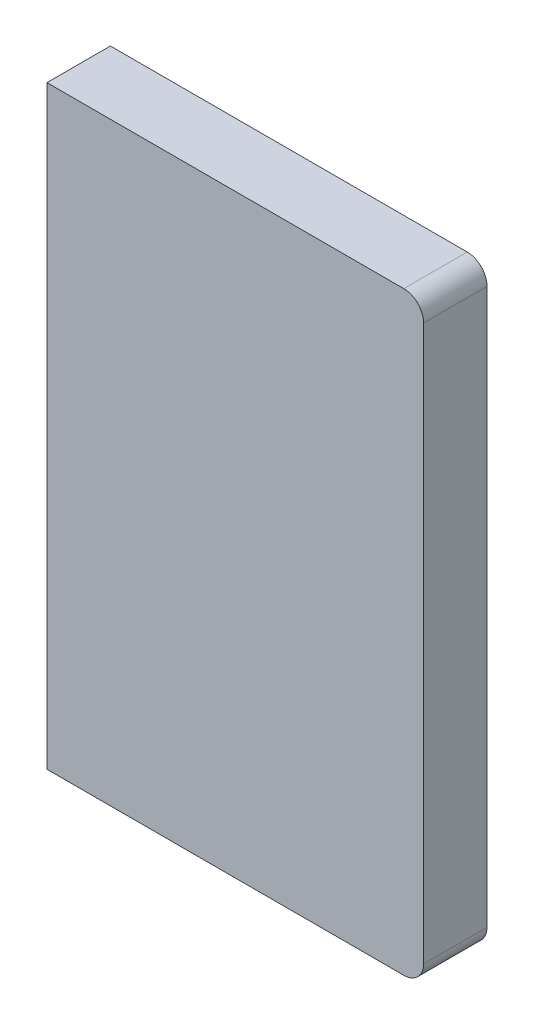
ISO-10303-21;
HEADER;
FILE_DESCRIPTION(('STEP AP214'),'2;1');
FILE_NAME('part.step','',(''),(''),'','','');
FILE_SCHEMA(('AUTOMOTIVE_DESIGN { 1 0 10303 214 1 1 1 1 }'));
ENDSEC;
DATA;
#1=APPLICATION_CONTEXT('core data for automotive mechanical design processes');
#2=APPLICATION_PROTOCOL_DEFINITION('international standard','automotive_design',2000,#1);
#3=PRODUCT_CONTEXT('',#1,'mechanical');
#4=PRODUCT('Part','Part','',(#3));
#5=PRODUCT_RELATED_PRODUCT_CATEGORY('part','',(#4));
#6=PRODUCT_DEFINITION_FORMATION('','',#4);
#7=PRODUCT_DEFINITION_CONTEXT('part definition',#1,'design');
#8=PRODUCT_DEFINITION('design','',#6,#7);
#9=PRODUCT_DEFINITION_SHAPE('','',#8);
#10=(LENGTH_UNIT() NAMED_UNIT(*) SI_UNIT(.MILLI.,.METRE.));
#11=(NAMED_UNIT(*) PLANE_ANGLE_UNIT() SI_UNIT($,.RADIAN.));
#12=(NAMED_UNIT(*) SI_UNIT($,.STERADIAN.) SOLID_ANGLE_UNIT());
#13=UNCERTAINTY_MEASURE_WITH_UNIT(LENGTH_MEASURE(1.E-05),#10,'distance_accuracy_value','');
#14=(GEOMETRIC_REPRESENTATION_CONTEXT(3) GLOBAL_UNCERTAINTY_ASSIGNED_CONTEXT((#13)) GLOBAL_UNIT_ASSIGNED_CONTEXT((#10,
#11,#12)) REPRESENTATION_CONTEXT('',''));
#15=CARTESIAN_POINT('',(0.,0.,0.));
#16=DIRECTION('',(0.,0.,1.));
#17=DIRECTION('',(1.,0.,0.));
#18=AXIS2_PLACEMENT_3D('',#15,#16,#17);
#19=CARTESIAN_POINT('',(-24.023067729949,103.735795388203,16.));
#20=DIRECTION('',(1.,0.,0.));
#21=DIRECTION('',(0.,1.,0.));
#22=AXIS2_PLACEMENT_3D('',#19,#20,#21);
#23=PLANE('',#22);
#24=DIRECTION('',(0.,-1.,0.));
#25=VECTOR('',#24,1.);
#26=CARTESIAN_POINT('',(-24.023067729949,103.735795388203,0.));
#27=LINE('',#26,#25);
#28=CARTESIAN_POINT('',(-24.023067729949,103.735795388203,0.));
#29=VERTEX_POINT('',#28);
#30=CARTESIAN_POINT('',(-24.023067729949,-46.2642046117975,0.));
#31=VERTEX_POINT('',#30);
#32=EDGE_CURVE('E105',#29,#31,#27,.T.);
#33=ORIENTED_EDGE('',*,*,#32,.T.);
#34=DIRECTION('',(0.,0.,-1.));
#35=VECTOR('',#34,1.);
#36=CARTESIAN_POINT('',(-24.023067729949,-46.2642046117975,16.));
#37=LINE('',#36,#35);
#38=CARTESIAN_POINT('',(-24.023067729949,-46.2642046117975,16.));
#39=VERTEX_POINT('',#38);
#40=EDGE_CURVE('E90',#39,#31,#37,.T.);
#41=ORIENTED_EDGE('',*,*,#40,.F.);
#42=DIRECTION('',(0.,-1.,0.));
#43=VECTOR('',#42,1.);
#44=CARTESIAN_POINT('',(-24.023067729949,103.735795388203,16.));
#45=LINE('',#44,#43);
#46=CARTESIAN_POINT('',(-24.023067729949,103.735795388203,16.));
#47=VERTEX_POINT('',#46);
#48=EDGE_CURVE('E94',#47,#39,#45,.T.);
#49=ORIENTED_EDGE('',*,*,#48,.F.);
#50=DIRECTION('',(0.,0.,-1.));
#51=VECTOR('',#50,1.);
#52=CARTESIAN_POINT('',(-24.023067729949,103.735795388203,16.));
#53=LINE('',#52,#51);
#54=EDGE_CURVE('E107',#47,#29,#53,.T.);
#55=ORIENTED_EDGE('',*,*,#54,.T.);
#56=EDGE_LOOP('',(#33,#41,#49,#55));
#57=FACE_BOUND('',#56,.T.);
#58=ADVANCED_FACE('F33',(#57),#23,.F.);
#59=CARTESIAN_POINT('',(-24.023067729949,-46.2642046117975,16.));
#60=DIRECTION('',(0.,1.,0.));
#61=DIRECTION('',(0.,0.,1.));
#62=AXIS2_PLACEMENT_3D('',#59,#60,#61);
#63=PLANE('',#62);
#64=DIRECTION('',(1.,0.,0.));
#65=VECTOR('',#64,1.);
#66=CARTESIAN_POINT('',(-24.023067729949,-46.2642046117975,0.));
#67=LINE('',#66,#65);
#68=CARTESIAN_POINT('',(65.976932270051,-46.2642046117975,0.));
#69=VERTEX_POINT('',#68);
#70=EDGE_CURVE('E133',#31,#69,#67,.T.);
#71=ORIENTED_EDGE('',*,*,#70,.T.);
#72=DIRECTION('',(0.,0.,-1.));
#73=VECTOR('',#72,1.);
#74=CARTESIAN_POINT('',(65.976932270051,-46.2642046117975,16.));
#75=LINE('',#74,#73);
#76=CARTESIAN_POINT('',(65.976932270051,-46.2642046117975,16.));
#77=VERTEX_POINT('',#76);
#78=EDGE_CURVE('E56',#69,#77,#75,.F.);
#79=ORIENTED_EDGE('',*,*,#78,.T.);
#80=DIRECTION('',(1.,0.,0.));
#81=VECTOR('',#80,1.);
#82=CARTESIAN_POINT('',(-24.023067729949,-46.2642046117975,16.));
#83=LINE('',#82,#81);
#84=EDGE_CURVE('E86',#39,#77,#83,.T.);
#85=ORIENTED_EDGE('',*,*,#84,.F.);
#86=ORIENTED_EDGE('',*,*,#40,.T.);
#87=EDGE_LOOP('',(#71,#79,#85,#86));
#88=FACE_BOUND('',#87,.T.);
#89=ADVANCED_FACE('F88',(#88),#63,.F.);
#90=CARTESIAN_POINT('',(70.976932270051,103.735795388203,16.));
#91=DIRECTION('',(-1.,0.,0.));
#92=DIRECTION('',(0.,-1.,0.));
#93=AXIS2_PLACEMENT_3D('',#90,#91,#92);
#94=PLANE('',#93);
#95=DIRECTION('',(0.,1.,0.));
#96=VECTOR('',#95,1.);
#97=CARTESIAN_POINT('',(70.976932270051,103.735795388203,16.));
#98=LINE('',#97,#96);
#99=CARTESIAN_POINT('',(70.976932270051,-41.2642046117975,16.));
#100=VERTEX_POINT('',#99);
#101=CARTESIAN_POINT('',(70.976932270051,98.7357953882025,16.));
#102=VERTEX_POINT('',#101);
#103=EDGE_CURVE('E93',#100,#102,#98,.T.);
#104=ORIENTED_EDGE('',*,*,#103,.F.);
#105=DIRECTION('',(0.,0.,-1.));
#106=VECTOR('',#105,1.);
#107=CARTESIAN_POINT('',(70.976932270051,-41.2642046117975,16.));
#108=LINE('',#107,#106);
#109=CARTESIAN_POINT('',(70.976932270051,-41.2642046117975,0.));
#110=VERTEX_POINT('',#109);
#111=EDGE_CURVE('E109',#100,#110,#108,.T.);
#112=ORIENTED_EDGE('',*,*,#111,.T.);
#113=DIRECTION('',(0.,1.,0.));
#114=VECTOR('',#113,1.);
#115=CARTESIAN_POINT('',(70.976932270051,103.735795388203,0.));
#116=LINE('',#115,#114);
#117=CARTESIAN_POINT('',(70.976932270051,98.7357953882025,0.));
#118=VERTEX_POINT('',#117);
#119=EDGE_CURVE('E134',#110,#118,#116,.T.);
#120=ORIENTED_EDGE('',*,*,#119,.T.);
#121=DIRECTION('',(0.,0.,-1.));
#122=VECTOR('',#121,1.);
#123=CARTESIAN_POINT('',(70.976932270051,98.7357953882025,16.));
#124=LINE('',#123,#122);
#125=EDGE_CURVE('E106',#118,#102,#124,.F.);
#126=ORIENTED_EDGE('',*,*,#125,.T.);
#127=EDGE_LOOP('',(#104,#112,#120,#126));
#128=FACE_BOUND('',#127,.T.);
#129=ADVANCED_FACE('F125',(#128),#94,.F.);
#130=CARTESIAN_POINT('',(-24.023067729949,103.735795388203,16.));
#131=DIRECTION('',(0.,-1.,0.));
#132=DIRECTION('',(0.,0.,-1.));
#133=AXIS2_PLACEMENT_3D('',#130,#131,#132);
#134=PLANE('',#133);
#135=DIRECTION('',(-1.,0.,0.));
#136=VECTOR('',#135,1.);
#137=CARTESIAN_POINT('',(-24.023067729949,103.735795388203,16.));
#138=LINE('',#137,#136);
#139=CARTESIAN_POINT('',(65.9769322700509,103.735795388203,16.));
#140=VERTEX_POINT('',#139);
#141=EDGE_CURVE('E98',#140,#47,#138,.T.);
#142=ORIENTED_EDGE('',*,*,#141,.F.);
#143=DIRECTION('',(0.,0.,-1.));
#144=VECTOR('',#143,1.);
#145=CARTESIAN_POINT('',(65.9769322700509,103.735795388203,16.));
#146=LINE('',#145,#144);
#147=CARTESIAN_POINT('',(65.9769322700509,103.735795388203,0.));
#148=VERTEX_POINT('',#147);
#149=EDGE_CURVE('E11',#140,#148,#146,.T.);
#150=ORIENTED_EDGE('',*,*,#149,.T.);
#151=DIRECTION('',(-1.,0.,0.));
#152=VECTOR('',#151,1.);
#153=CARTESIAN_POINT('',(-24.023067729949,103.735795388203,0.));
#154=LINE('',#153,#152);
#155=EDGE_CURVE('E102',#148,#29,#154,.T.);
#156=ORIENTED_EDGE('',*,*,#155,.T.);
#157=ORIENTED_EDGE('',*,*,#54,.F.);
#158=EDGE_LOOP('',(#142,#150,#156,#157));
#159=FACE_BOUND('',#158,.T.);
#160=ADVANCED_FACE('F141',(#159),#134,.F.);
#161=CARTESIAN_POINT('',(0.,0.,16.));
#162=DIRECTION('',(0.,0.,1.));
#163=DIRECTION('',(1.,0.,0.));
#164=AXIS2_PLACEMENT_3D('',#161,#162,#163);
#165=PLANE('',#164);
#166=ORIENTED_EDGE('',*,*,#84,.T.);
#167=CARTESIAN_POINT('',(65.976932270051,-41.2642046117975,16.));
#168=DIRECTION('',(0.,0.,1.));
#169=DIRECTION('',(1.,0.,0.));
#170=AXIS2_PLACEMENT_3D('',#167,#168,#169);
#171=CIRCLE('',#170,5.);
#172=EDGE_CURVE('E41',#77,#100,#171,.T.);
#173=ORIENTED_EDGE('',*,*,#172,.T.);
#174=ORIENTED_EDGE('',*,*,#103,.T.);
#175=CARTESIAN_POINT('',(65.9769322700509,98.7357953882025,16.));
#176=DIRECTION('',(0.,0.,1.));
#177=DIRECTION('',(1.,0.,0.));
#178=AXIS2_PLACEMENT_3D('',#175,#176,#177);
#179=CIRCLE('',#178,5.);
#180=EDGE_CURVE('E48',#102,#140,#179,.T.);
#181=ORIENTED_EDGE('',*,*,#180,.T.);
#182=ORIENTED_EDGE('',*,*,#141,.T.);
#183=ORIENTED_EDGE('',*,*,#48,.T.);
#184=EDGE_LOOP('',(#166,#173,#174,#181,#182,#183));
#185=FACE_BOUND('',#184,.T.);
#186=ADVANCED_FACE('F97',(#185),#165,.T.);
#187=CARTESIAN_POINT('',(0.,0.,0.));
#188=DIRECTION('',(0.,0.,1.));
#189=DIRECTION('',(1.,0.,0.));
#190=AXIS2_PLACEMENT_3D('',#187,#188,#189);
#191=PLANE('',#190);
#192=ORIENTED_EDGE('',*,*,#119,.F.);
#193=CARTESIAN_POINT('',(65.976932270051,-41.2642046117975,0.));
#194=DIRECTION('',(0.,0.,1.));
#195=DIRECTION('',(1.,0.,0.));
#196=AXIS2_PLACEMENT_3D('',#193,#194,#195);
#197=CIRCLE('',#196,5.);
#198=EDGE_CURVE('E118',#110,#69,#197,.F.);
#199=ORIENTED_EDGE('',*,*,#198,.T.);
#200=ORIENTED_EDGE('',*,*,#70,.F.);
#201=ORIENTED_EDGE('',*,*,#32,.F.);
#202=ORIENTED_EDGE('',*,*,#155,.F.);
#203=CARTESIAN_POINT('',(65.9769322700509,98.7357953882025,0.));
#204=DIRECTION('',(0.,0.,1.));
#205=DIRECTION('',(1.,0.,0.));
#206=AXIS2_PLACEMENT_3D('',#203,#204,#205);
#207=CIRCLE('',#206,5.);
#208=EDGE_CURVE('E116',#148,#118,#207,.F.);
#209=ORIENTED_EDGE('',*,*,#208,.T.);
#210=EDGE_LOOP('',(#192,#199,#200,#201,#202,#209));
#211=FACE_BOUND('',#210,.T.);
#212=ADVANCED_FACE('F132',(#211),#191,.F.);
#213=CARTESIAN_POINT('',(65.976932270051,-41.2642046117975,16.));
#214=DIRECTION('',(0.,0.,-1.));
#215=DIRECTION('',(-1.,0.,0.));
#216=AXIS2_PLACEMENT_3D('',#213,#214,#215);
#217=CYLINDRICAL_SURFACE('',#216,5.);
#218=ORIENTED_EDGE('',*,*,#172,.F.);
#219=ORIENTED_EDGE('',*,*,#78,.F.);
#220=ORIENTED_EDGE('',*,*,#198,.F.);
#221=ORIENTED_EDGE('',*,*,#111,.F.);
#222=EDGE_LOOP('',(#218,#219,#220,#221));
#223=FACE_BOUND('',#222,.T.);
#224=ADVANCED_FACE('F130',(#223),#217,.T.);
#225=CARTESIAN_POINT('',(65.9769322700509,98.7357953882025,16.));
#226=DIRECTION('',(0.,0.,-1.));
#227=DIRECTION('',(-1.,0.,0.));
#228=AXIS2_PLACEMENT_3D('',#225,#226,#227);
#229=CYLINDRICAL_SURFACE('',#228,5.);
#230=ORIENTED_EDGE('',*,*,#180,.F.);
#231=ORIENTED_EDGE('',*,*,#125,.F.);
#232=ORIENTED_EDGE('',*,*,#208,.F.);
#233=ORIENTED_EDGE('',*,*,#149,.F.);
#234=EDGE_LOOP('',(#230,#231,#232,#233));
#235=FACE_BOUND('',#234,.T.);
#236=ADVANCED_FACE('F35',(#235),#229,.T.);
#237=CLOSED_SHELL('',(#58,#89,#129,#160,#186,#212,#224,#236));
#238=MANIFOLD_SOLID_BREP('B2',#237);
#239=ADVANCED_BREP_SHAPE_REPRESENTATION('',(#18,#238),#14);
#240=SHAPE_DEFINITION_REPRESENTATION(#9,#239);
ENDSEC;
END-ISO-10303-21;
